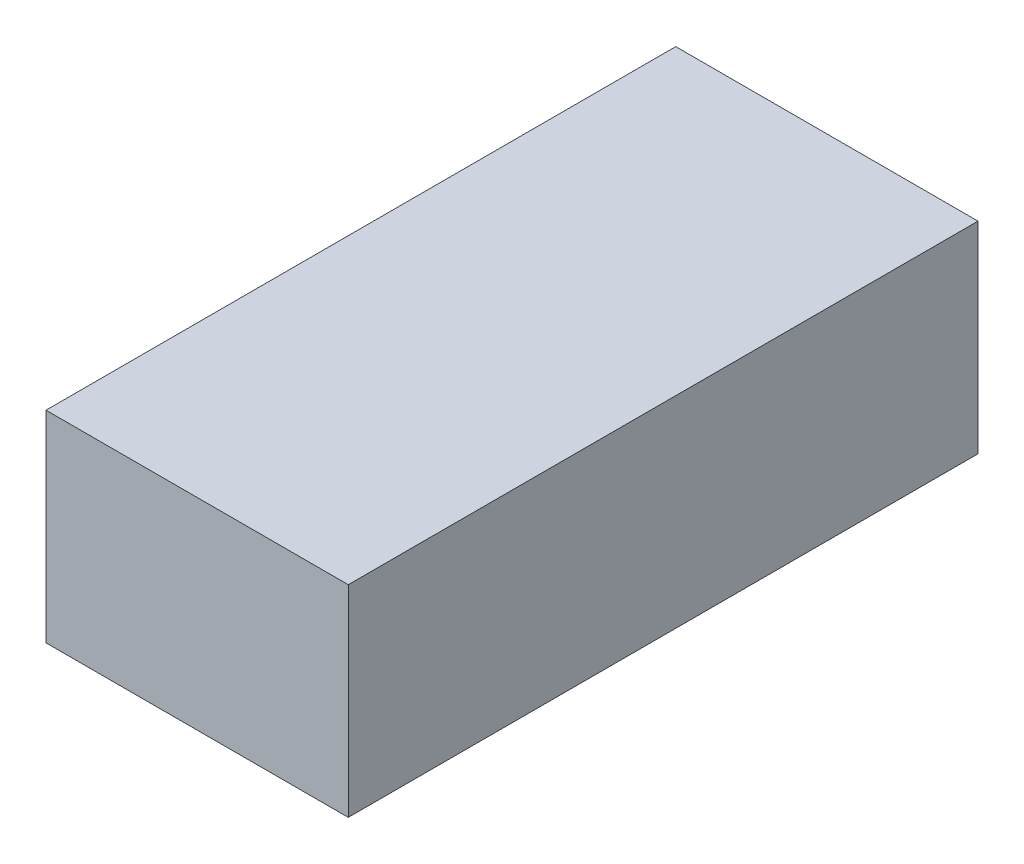
ISO-10303-21;
HEADER;
FILE_DESCRIPTION(('STEP AP214'),'2;1');
FILE_NAME('part.step','',(''),(''),'','','');
FILE_SCHEMA(('AUTOMOTIVE_DESIGN { 1 0 10303 214 1 1 1 1 }'));
ENDSEC;
DATA;
#1=APPLICATION_CONTEXT('core data for automotive mechanical design processes');
#2=APPLICATION_PROTOCOL_DEFINITION('international standard','automotive_design',2000,#1);
#3=PRODUCT_CONTEXT('',#1,'mechanical');
#4=PRODUCT('Part','Part','',(#3));
#5=PRODUCT_RELATED_PRODUCT_CATEGORY('part','',(#4));
#6=PRODUCT_DEFINITION_FORMATION('','',#4);
#7=PRODUCT_DEFINITION_CONTEXT('part definition',#1,'design');
#8=PRODUCT_DEFINITION('design','',#6,#7);
#9=PRODUCT_DEFINITION_SHAPE('','',#8);
#10=(LENGTH_UNIT() NAMED_UNIT(*) SI_UNIT(.MILLI.,.METRE.));
#11=(NAMED_UNIT(*) PLANE_ANGLE_UNIT() SI_UNIT($,.RADIAN.));
#12=(NAMED_UNIT(*) SI_UNIT($,.STERADIAN.) SOLID_ANGLE_UNIT());
#13=UNCERTAINTY_MEASURE_WITH_UNIT(LENGTH_MEASURE(1.E-05),#10,'distance_accuracy_value','');
#14=(GEOMETRIC_REPRESENTATION_CONTEXT(3) GLOBAL_UNCERTAINTY_ASSIGNED_CONTEXT((#13)) GLOBAL_UNIT_ASSIGNED_CONTEXT((#10,
#11,#12)) REPRESENTATION_CONTEXT('',''));
#15=CARTESIAN_POINT('',(0.,0.,0.));
#16=DIRECTION('',(0.,0.,1.));
#17=DIRECTION('',(1.,0.,0.));
#18=AXIS2_PLACEMENT_3D('',#15,#16,#17);
#19=CARTESIAN_POINT('',(4.7625,6.35,9.921875));
#20=DIRECTION('',(-1.,0.,0.));
#21=DIRECTION('',(0.,0.,1.));
#22=AXIS2_PLACEMENT_3D('',#19,#20,#21);
#23=PLANE('',#22);
#24=DIRECTION('',(0.,0.,-1.));
#25=VECTOR('',#24,1.);
#26=CARTESIAN_POINT('',(4.7625,0.,9.921875));
#27=LINE('',#26,#25);
#28=CARTESIAN_POINT('',(4.7625,0.,9.921875));
#29=VERTEX_POINT('',#28);
#30=CARTESIAN_POINT('',(4.7625,0.,-9.921875));
#31=VERTEX_POINT('',#30);
#32=EDGE_CURVE('E96',#29,#31,#27,.T.);
#33=ORIENTED_EDGE('',*,*,#32,.T.);
#34=DIRECTION('',(0.,-1.,0.));
#35=VECTOR('',#34,1.);
#36=CARTESIAN_POINT('',(4.7625,6.35,-9.921875));
#37=LINE('',#36,#35);
#38=CARTESIAN_POINT('',(4.7625,6.35,-9.921875));
#39=VERTEX_POINT('',#38);
#40=EDGE_CURVE('E11',#39,#31,#37,.T.);
#41=ORIENTED_EDGE('',*,*,#40,.F.);
#42=DIRECTION('',(0.,0.,-1.));
#43=VECTOR('',#42,1.);
#44=CARTESIAN_POINT('',(4.7625,6.35,9.921875));
#45=LINE('',#44,#43);
#46=CARTESIAN_POINT('',(4.7625,6.35,9.921875));
#47=VERTEX_POINT('',#46);
#48=EDGE_CURVE('E84',#47,#39,#45,.T.);
#49=ORIENTED_EDGE('',*,*,#48,.F.);
#50=DIRECTION('',(0.,-1.,0.));
#51=VECTOR('',#50,1.);
#52=CARTESIAN_POINT('',(4.7625,6.35,9.921875));
#53=LINE('',#52,#51);
#54=EDGE_CURVE('E92',#47,#29,#53,.T.);
#55=ORIENTED_EDGE('',*,*,#54,.T.);
#56=EDGE_LOOP('',(#33,#41,#49,#55));
#57=FACE_BOUND('',#56,.T.);
#58=ADVANCED_FACE('F33',(#57),#23,.F.);
#59=CARTESIAN_POINT('',(-4.7625,6.35,-9.921875));
#60=DIRECTION('',(0.,0.,1.));
#61=DIRECTION('',(1.,0.,0.));
#62=AXIS2_PLACEMENT_3D('',#59,#60,#61);
#63=PLANE('',#62);
#64=DIRECTION('',(-1.,0.,0.));
#65=VECTOR('',#64,1.);
#66=CARTESIAN_POINT('',(-4.7625,0.,-9.921875));
#67=LINE('',#66,#65);
#68=CARTESIAN_POINT('',(-4.7625,0.,-9.921875));
#69=VERTEX_POINT('',#68);
#70=EDGE_CURVE('E88',#31,#69,#67,.T.);
#71=ORIENTED_EDGE('',*,*,#70,.T.);
#72=DIRECTION('',(0.,-1.,0.));
#73=VECTOR('',#72,1.);
#74=CARTESIAN_POINT('',(-4.7625,6.35,-9.921875));
#75=LINE('',#74,#73);
#76=CARTESIAN_POINT('',(-4.7625,6.35,-9.921875));
#77=VERTEX_POINT('',#76);
#78=EDGE_CURVE('E41',#77,#69,#75,.T.);
#79=ORIENTED_EDGE('',*,*,#78,.F.);
#80=DIRECTION('',(-1.,0.,0.));
#81=VECTOR('',#80,1.);
#82=CARTESIAN_POINT('',(-4.7625,6.35,-9.921875));
#83=LINE('',#82,#81);
#84=EDGE_CURVE('E79',#39,#77,#83,.T.);
#85=ORIENTED_EDGE('',*,*,#84,.F.);
#86=ORIENTED_EDGE('',*,*,#40,.T.);
#87=EDGE_LOOP('',(#71,#79,#85,#86));
#88=FACE_BOUND('',#87,.T.);
#89=ADVANCED_FACE('F87',(#88),#63,.F.);
#90=CARTESIAN_POINT('',(-4.7625,6.35,9.921875));
#91=DIRECTION('',(1.,0.,0.));
#92=DIRECTION('',(0.,0.,-1.));
#93=AXIS2_PLACEMENT_3D('',#90,#91,#92);
#94=PLANE('',#93);
#95=DIRECTION('',(0.,0.,1.));
#96=VECTOR('',#95,1.);
#97=CARTESIAN_POINT('',(-4.7625,0.,9.921875));
#98=LINE('',#97,#96);
#99=CARTESIAN_POINT('',(-4.7625,0.,9.921875));
#100=VERTEX_POINT('',#99);
#101=EDGE_CURVE('E66',#69,#100,#98,.T.);
#102=ORIENTED_EDGE('',*,*,#101,.T.);
#103=DIRECTION('',(0.,-1.,0.));
#104=VECTOR('',#103,1.);
#105=CARTESIAN_POINT('',(-4.7625,6.35,9.921875));
#106=LINE('',#105,#104);
#107=CARTESIAN_POINT('',(-4.7625,6.35,9.921875));
#108=VERTEX_POINT('',#107);
#109=EDGE_CURVE('E89',#108,#100,#106,.T.);
#110=ORIENTED_EDGE('',*,*,#109,.F.);
#111=DIRECTION('',(0.,0.,1.));
#112=VECTOR('',#111,1.);
#113=CARTESIAN_POINT('',(-4.7625,6.35,9.921875));
#114=LINE('',#113,#112);
#115=EDGE_CURVE('E82',#77,#108,#114,.T.);
#116=ORIENTED_EDGE('',*,*,#115,.F.);
#117=ORIENTED_EDGE('',*,*,#78,.T.);
#118=EDGE_LOOP('',(#102,#110,#116,#117));
#119=FACE_BOUND('',#118,.T.);
#120=ADVANCED_FACE('F90',(#119),#94,.F.);
#121=CARTESIAN_POINT('',(-4.7625,6.35,9.921875));
#122=DIRECTION('',(0.,0.,-1.));
#123=DIRECTION('',(-1.,0.,0.));
#124=AXIS2_PLACEMENT_3D('',#121,#122,#123);
#125=PLANE('',#124);
#126=DIRECTION('',(1.,0.,0.));
#127=VECTOR('',#126,1.);
#128=CARTESIAN_POINT('',(-4.7625,0.,9.921875));
#129=LINE('',#128,#127);
#130=EDGE_CURVE('E72',#100,#29,#129,.T.);
#131=ORIENTED_EDGE('',*,*,#130,.T.);
#132=ORIENTED_EDGE('',*,*,#54,.F.);
#133=DIRECTION('',(1.,0.,0.));
#134=VECTOR('',#133,1.);
#135=CARTESIAN_POINT('',(-4.7625,6.35,9.921875));
#136=LINE('',#135,#134);
#137=EDGE_CURVE('E49',#108,#47,#136,.T.);
#138=ORIENTED_EDGE('',*,*,#137,.F.);
#139=ORIENTED_EDGE('',*,*,#109,.T.);
#140=EDGE_LOOP('',(#131,#132,#138,#139));
#141=FACE_BOUND('',#140,.T.);
#142=ADVANCED_FACE('F103',(#141),#125,.F.);
#143=CARTESIAN_POINT('',(0.,6.35,0.));
#144=DIRECTION('',(0.,-1.,0.));
#145=DIRECTION('',(0.,0.,-1.));
#146=AXIS2_PLACEMENT_3D('',#143,#144,#145);
#147=PLANE('',#146);
#148=ORIENTED_EDGE('',*,*,#48,.T.);
#149=ORIENTED_EDGE('',*,*,#84,.T.);
#150=ORIENTED_EDGE('',*,*,#115,.T.);
#151=ORIENTED_EDGE('',*,*,#137,.T.);
#152=EDGE_LOOP('',(#148,#149,#150,#151));
#153=FACE_BOUND('',#152,.T.);
#154=ADVANCED_FACE('F80',(#153),#147,.F.);
#155=CARTESIAN_POINT('',(0.,0.,0.));
#156=DIRECTION('',(0.,-1.,0.));
#157=DIRECTION('',(0.,0.,-1.));
#158=AXIS2_PLACEMENT_3D('',#155,#156,#157);
#159=PLANE('',#158);
#160=ORIENTED_EDGE('',*,*,#32,.F.);
#161=ORIENTED_EDGE('',*,*,#130,.F.);
#162=ORIENTED_EDGE('',*,*,#101,.F.);
#163=ORIENTED_EDGE('',*,*,#70,.F.);
#164=EDGE_LOOP('',(#160,#161,#162,#163));
#165=FACE_BOUND('',#164,.T.);
#166=ADVANCED_FACE('F106',(#165),#159,.T.);
#167=CLOSED_SHELL('',(#58,#89,#120,#142,#154,#166));
#168=MANIFOLD_SOLID_BREP('B2',#167);
#169=ADVANCED_BREP_SHAPE_REPRESENTATION('',(#18,#168),#14);
#170=SHAPE_DEFINITION_REPRESENTATION(#9,#169);
ENDSEC;
END-ISO-10303-21;
